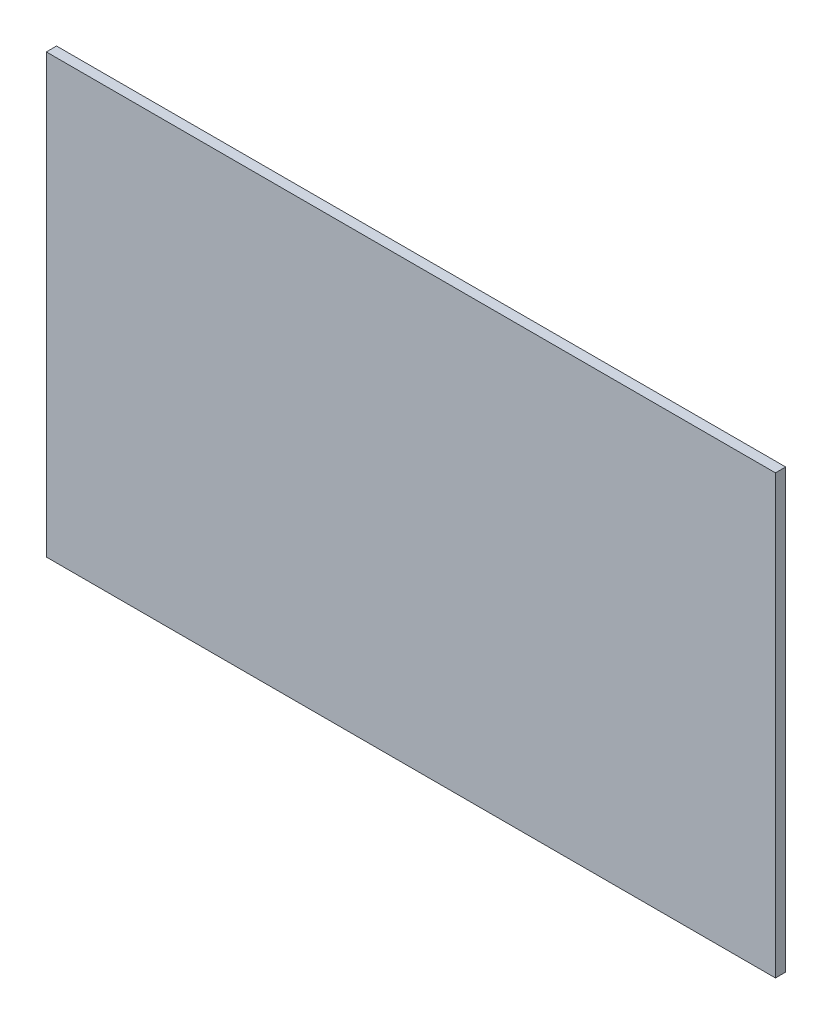
ISO-10303-21;
HEADER;
FILE_DESCRIPTION(('STEP AP214'),'2;1');
FILE_NAME('part.step','',(''),(''),'','','');
FILE_SCHEMA(('AUTOMOTIVE_DESIGN { 1 0 10303 214 1 1 1 1 }'));
ENDSEC;
DATA;
#1=APPLICATION_CONTEXT('core data for automotive mechanical design processes');
#2=APPLICATION_PROTOCOL_DEFINITION('international standard','automotive_design',2000,#1);
#3=PRODUCT_CONTEXT('',#1,'mechanical');
#4=PRODUCT('Part','Part','',(#3));
#5=PRODUCT_RELATED_PRODUCT_CATEGORY('part','',(#4));
#6=PRODUCT_DEFINITION_FORMATION('','',#4);
#7=PRODUCT_DEFINITION_CONTEXT('part definition',#1,'design');
#8=PRODUCT_DEFINITION('design','',#6,#7);
#9=PRODUCT_DEFINITION_SHAPE('','',#8);
#10=(LENGTH_UNIT() NAMED_UNIT(*) SI_UNIT(.MILLI.,.METRE.));
#11=(NAMED_UNIT(*) PLANE_ANGLE_UNIT() SI_UNIT($,.RADIAN.));
#12=(NAMED_UNIT(*) SI_UNIT($,.STERADIAN.) SOLID_ANGLE_UNIT());
#13=UNCERTAINTY_MEASURE_WITH_UNIT(LENGTH_MEASURE(1.E-05),#10,'distance_accuracy_value','');
#14=(GEOMETRIC_REPRESENTATION_CONTEXT(3) GLOBAL_UNCERTAINTY_ASSIGNED_CONTEXT((#13)) GLOBAL_UNIT_ASSIGNED_CONTEXT((#10,
#11,#12)) REPRESENTATION_CONTEXT('',''));
#15=CARTESIAN_POINT('',(0.,0.,0.));
#16=DIRECTION('',(0.,0.,1.));
#17=DIRECTION('',(1.,0.,0.));
#18=AXIS2_PLACEMENT_3D('',#15,#16,#17);
#19=CARTESIAN_POINT('',(106.49,-77.57,1.635));
#20=DIRECTION('',(0.,0.,-1.));
#21=DIRECTION('',(0.,-1.,0.));
#22=AXIS2_PLACEMENT_3D('',#19,#20,#21);
#23=PLANE('',#22);
#24=DIRECTION('',(0.,-1.,0.));
#25=VECTOR('',#24,1.);
#26=CARTESIAN_POINT('',(107.74,-76.82,1.635));
#27=LINE('',#26,#25);
#28=CARTESIAN_POINT('',(107.74,-76.82,1.635));
#29=VERTEX_POINT('',#28);
#30=CARTESIAN_POINT('',(107.74,-78.32,1.635));
#31=VERTEX_POINT('',#30);
#32=EDGE_CURVE('E27',#29,#31,#27,.T.);
#33=ORIENTED_EDGE('',*,*,#32,.F.);
#34=DIRECTION('',(1.,0.,0.));
#35=VECTOR('',#34,1.);
#36=CARTESIAN_POINT('',(105.24,-76.82,1.635));
#37=LINE('',#36,#35);
#38=CARTESIAN_POINT('',(105.24,-76.82,1.635));
#39=VERTEX_POINT('',#38);
#40=EDGE_CURVE('E64',#39,#29,#37,.T.);
#41=ORIENTED_EDGE('',*,*,#40,.F.);
#42=DIRECTION('',(0.,1.,0.));
#43=VECTOR('',#42,1.);
#44=CARTESIAN_POINT('',(105.24,-78.32,1.635));
#45=LINE('',#44,#43);
#46=CARTESIAN_POINT('',(105.24,-78.32,1.635));
#47=VERTEX_POINT('',#46);
#48=EDGE_CURVE('E67',#47,#39,#45,.T.);
#49=ORIENTED_EDGE('',*,*,#48,.F.);
#50=DIRECTION('',(-1.,0.,0.));
#51=VECTOR('',#50,1.);
#52=CARTESIAN_POINT('',(107.74,-78.32,1.635));
#53=LINE('',#52,#51);
#54=EDGE_CURVE('E112',#31,#47,#53,.T.);
#55=ORIENTED_EDGE('',*,*,#54,.F.);
#56=EDGE_LOOP('',(#33,#41,#49,#55));
#57=FACE_BOUND('',#56,.T.);
#58=ADVANCED_FACE('F17',(#57),#23,.F.);
#59=CARTESIAN_POINT('',(106.49,-77.57,1.6));
#60=DIRECTION('',(0.,0.,-1.));
#61=DIRECTION('',(0.,-1.,0.));
#62=AXIS2_PLACEMENT_3D('',#59,#60,#61);
#63=PLANE('',#62);
#64=DIRECTION('',(-1.,0.,0.));
#65=VECTOR('',#64,1.);
#66=CARTESIAN_POINT('',(107.74,-78.32,1.6));
#67=LINE('',#66,#65);
#68=CARTESIAN_POINT('',(107.74,-78.32,1.6));
#69=VERTEX_POINT('',#68);
#70=CARTESIAN_POINT('',(105.24,-78.32,1.6));
#71=VERTEX_POINT('',#70);
#72=EDGE_CURVE('E87',#69,#71,#67,.T.);
#73=ORIENTED_EDGE('',*,*,#72,.T.);
#74=DIRECTION('',(0.,1.,0.));
#75=VECTOR('',#74,1.);
#76=CARTESIAN_POINT('',(105.24,-78.32,1.6));
#77=LINE('',#76,#75);
#78=CARTESIAN_POINT('',(105.24,-76.82,1.6));
#79=VERTEX_POINT('',#78);
#80=EDGE_CURVE('E73',#71,#79,#77,.T.);
#81=ORIENTED_EDGE('',*,*,#80,.T.);
#82=DIRECTION('',(1.,0.,0.));
#83=VECTOR('',#82,1.);
#84=CARTESIAN_POINT('',(105.24,-76.82,1.6));
#85=LINE('',#84,#83);
#86=CARTESIAN_POINT('',(107.74,-76.82,1.6));
#87=VERTEX_POINT('',#86);
#88=EDGE_CURVE('E21',#79,#87,#85,.T.);
#89=ORIENTED_EDGE('',*,*,#88,.T.);
#90=DIRECTION('',(0.,-1.,0.));
#91=VECTOR('',#90,1.);
#92=CARTESIAN_POINT('',(107.74,-76.82,1.6));
#93=LINE('',#92,#91);
#94=EDGE_CURVE('E11',#87,#69,#93,.T.);
#95=ORIENTED_EDGE('',*,*,#94,.T.);
#96=EDGE_LOOP('',(#73,#81,#89,#95));
#97=FACE_BOUND('',#96,.T.);
#98=ADVANCED_FACE('F19',(#97),#63,.T.);
#99=CARTESIAN_POINT('',(107.74,-76.82,1.6));
#100=DIRECTION('',(1.,0.,0.));
#101=DIRECTION('',(0.,1.,0.));
#102=AXIS2_PLACEMENT_3D('',#99,#100,#101);
#103=PLANE('',#102);
#104=DIRECTION('',(0.,0.,1.));
#105=VECTOR('',#104,1.);
#106=CARTESIAN_POINT('',(107.74,-76.82,1.6));
#107=LINE('',#106,#105);
#108=EDGE_CURVE('E72',#87,#29,#107,.T.);
#109=ORIENTED_EDGE('',*,*,#108,.T.);
#110=ORIENTED_EDGE('',*,*,#32,.T.);
#111=DIRECTION('',(0.,0.,1.));
#112=VECTOR('',#111,1.);
#113=CARTESIAN_POINT('',(107.74,-78.32,1.6));
#114=LINE('',#113,#112);
#115=EDGE_CURVE('E111',#69,#31,#114,.T.);
#116=ORIENTED_EDGE('',*,*,#115,.F.);
#117=ORIENTED_EDGE('',*,*,#94,.F.);
#118=EDGE_LOOP('',(#109,#110,#116,#117));
#119=FACE_BOUND('',#118,.T.);
#120=ADVANCED_FACE('F140',(#119),#103,.T.);
#121=CARTESIAN_POINT('',(105.24,-76.82,1.6));
#122=DIRECTION('',(0.,1.,0.));
#123=DIRECTION('',(1.,0.,0.));
#124=AXIS2_PLACEMENT_3D('',#121,#122,#123);
#125=PLANE('',#124);
#126=DIRECTION('',(0.,0.,1.));
#127=VECTOR('',#126,1.);
#128=CARTESIAN_POINT('',(105.24,-76.82,1.6));
#129=LINE('',#128,#127);
#130=EDGE_CURVE('E76',#79,#39,#129,.T.);
#131=ORIENTED_EDGE('',*,*,#130,.T.);
#132=ORIENTED_EDGE('',*,*,#40,.T.);
#133=ORIENTED_EDGE('',*,*,#108,.F.);
#134=ORIENTED_EDGE('',*,*,#88,.F.);
#135=EDGE_LOOP('',(#131,#132,#133,#134));
#136=FACE_BOUND('',#135,.T.);
#137=ADVANCED_FACE('F77',(#136),#125,.T.);
#138=CARTESIAN_POINT('',(105.24,-78.32,1.6));
#139=DIRECTION('',(-1.,0.,0.));
#140=DIRECTION('',(0.,0.,1.));
#141=AXIS2_PLACEMENT_3D('',#138,#139,#140);
#142=PLANE('',#141);
#143=DIRECTION('',(0.,0.,1.));
#144=VECTOR('',#143,1.);
#145=CARTESIAN_POINT('',(105.24,-78.32,1.6));
#146=LINE('',#145,#144);
#147=EDGE_CURVE('E84',#71,#47,#146,.T.);
#148=ORIENTED_EDGE('',*,*,#147,.T.);
#149=ORIENTED_EDGE('',*,*,#48,.T.);
#150=ORIENTED_EDGE('',*,*,#130,.F.);
#151=ORIENTED_EDGE('',*,*,#80,.F.);
#152=EDGE_LOOP('',(#148,#149,#150,#151));
#153=FACE_BOUND('',#152,.T.);
#154=ADVANCED_FACE('F82',(#153),#142,.T.);
#155=CARTESIAN_POINT('',(107.74,-78.32,1.6));
#156=DIRECTION('',(0.,-1.,0.));
#157=DIRECTION('',(0.,0.,-1.));
#158=AXIS2_PLACEMENT_3D('',#155,#156,#157);
#159=PLANE('',#158);
#160=ORIENTED_EDGE('',*,*,#115,.T.);
#161=ORIENTED_EDGE('',*,*,#54,.T.);
#162=ORIENTED_EDGE('',*,*,#147,.F.);
#163=ORIENTED_EDGE('',*,*,#72,.F.);
#164=EDGE_LOOP('',(#160,#161,#162,#163));
#165=FACE_BOUND('',#164,.T.);
#166=ADVANCED_FACE('F137',(#165),#159,.T.);
#167=CLOSED_SHELL('',(#58,#98,#120,#137,#154,#166));
#168=MANIFOLD_SOLID_BREP('B1',#167);
#169=ADVANCED_BREP_SHAPE_REPRESENTATION('',(#18,#168),#14);
#170=SHAPE_DEFINITION_REPRESENTATION(#9,#169);
ENDSEC;
END-ISO-10303-21;
